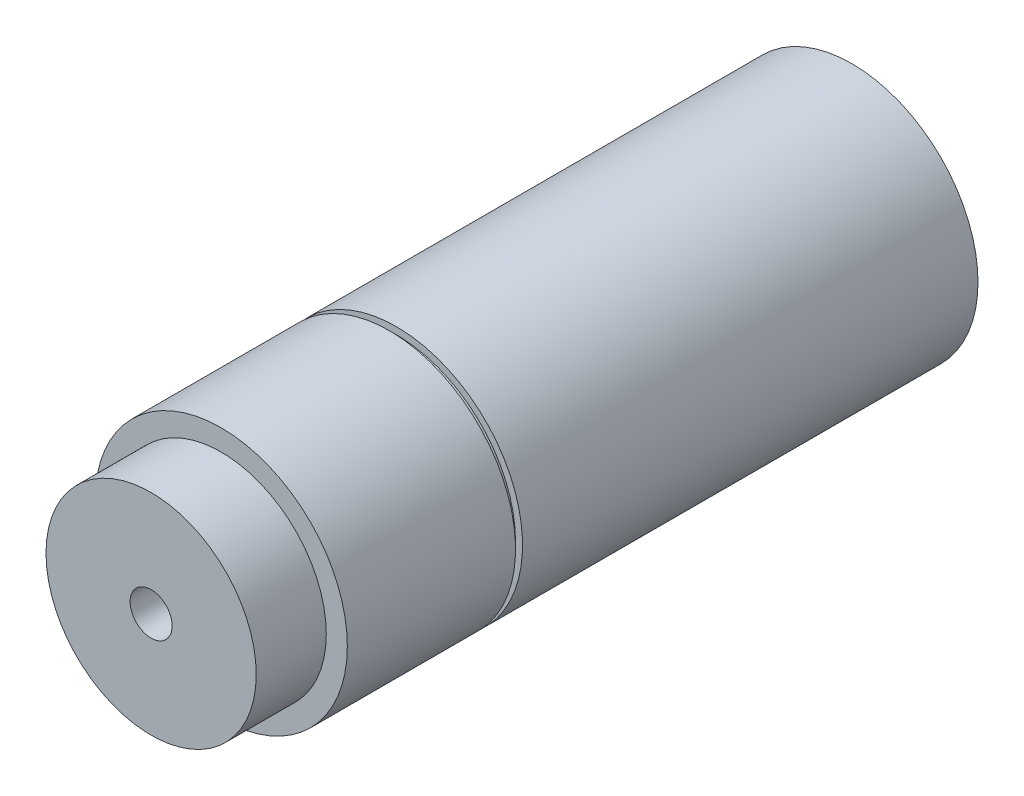
ISO-10303-21;
HEADER;
FILE_DESCRIPTION(('STEP AP214'),'2;1');
FILE_NAME('part.step','',(''),(''),'','','');
FILE_SCHEMA(('AUTOMOTIVE_DESIGN { 1 0 10303 214 1 1 1 1 }'));
ENDSEC;
DATA;
#1=APPLICATION_CONTEXT('core data for automotive mechanical design processes');
#2=APPLICATION_PROTOCOL_DEFINITION('international standard','automotive_design',2000,#1);
#3=PRODUCT_CONTEXT('',#1,'mechanical');
#4=PRODUCT('Part','Part','',(#3));
#5=PRODUCT_RELATED_PRODUCT_CATEGORY('part','',(#4));
#6=PRODUCT_DEFINITION_FORMATION('','',#4);
#7=PRODUCT_DEFINITION_CONTEXT('part definition',#1,'design');
#8=PRODUCT_DEFINITION('design','',#6,#7);
#9=PRODUCT_DEFINITION_SHAPE('','',#8);
#10=(LENGTH_UNIT() NAMED_UNIT(*) SI_UNIT(.MILLI.,.METRE.));
#11=(NAMED_UNIT(*) PLANE_ANGLE_UNIT() SI_UNIT($,.RADIAN.));
#12=(NAMED_UNIT(*) SI_UNIT($,.STERADIAN.) SOLID_ANGLE_UNIT());
#13=UNCERTAINTY_MEASURE_WITH_UNIT(LENGTH_MEASURE(1.E-05),#10,'distance_accuracy_value','');
#14=(GEOMETRIC_REPRESENTATION_CONTEXT(3) GLOBAL_UNCERTAINTY_ASSIGNED_CONTEXT((#13)) GLOBAL_UNIT_ASSIGNED_CONTEXT((#10,
#11,#12)) REPRESENTATION_CONTEXT('',''));
#15=CARTESIAN_POINT('',(0.,0.,0.));
#16=DIRECTION('',(0.,0.,1.));
#17=DIRECTION('',(1.,0.,0.));
#18=AXIS2_PLACEMENT_3D('',#15,#16,#17);
#19=CARTESIAN_POINT('',(0.,0.,100.));
#20=DIRECTION('',(0.,0.,-1.));
#21=DIRECTION('',(-1.,0.,0.));
#22=AXIS2_PLACEMENT_3D('',#19,#20,#21);
#23=CYLINDRICAL_SURFACE('',#22,18.);
#24=CARTESIAN_POINT('',(0.,0.,90.));
#25=DIRECTION('',(0.,0.,1.));
#26=DIRECTION('',(1.,0.,0.));
#27=AXIS2_PLACEMENT_3D('',#24,#25,#26);
#28=CIRCLE('',#27,18.);
#29=CARTESIAN_POINT('',(18.,0.,90.));
#30=VERTEX_POINT('',#29);
#31=EDGE_CURVE('E42',#30,#30,#28,.T.);
#32=ORIENTED_EDGE('',*,*,#31,.F.);
#33=EDGE_LOOP('',(#32));
#34=FACE_BOUND('',#33,.T.);
#35=CARTESIAN_POINT('',(0.,0.,66.));
#36=DIRECTION('',(0.,0.,-1.));
#37=DIRECTION('',(-1.,0.,0.));
#38=AXIS2_PLACEMENT_3D('',#35,#36,#37);
#39=CIRCLE('',#38,18.);
#40=CARTESIAN_POINT('',(-18.,0.,66.));
#41=VERTEX_POINT('',#40);
#42=EDGE_CURVE('E65',#41,#41,#39,.T.);
#43=ORIENTED_EDGE('',*,*,#42,.F.);
#44=EDGE_LOOP('',(#43));
#45=FACE_BOUND('',#44,.T.);
#46=ADVANCED_FACE('F38',(#34,#45),#23,.T.);
#47=CARTESIAN_POINT('',(0.,0.,65.));
#48=DIRECTION('',(0.,0.,-1.));
#49=DIRECTION('',(-1.,0.,0.));
#50=AXIS2_PLACEMENT_3D('',#47,#48,#49);
#51=CIRCLE('',#50,18.);
#52=CARTESIAN_POINT('',(-18.,0.,65.));
#53=VERTEX_POINT('',#52);
#54=EDGE_CURVE('E69',#53,#53,#51,.T.);
#55=ORIENTED_EDGE('',*,*,#54,.T.);
#56=EDGE_LOOP('',(#55));
#57=FACE_BOUND('',#56,.T.);
#58=CARTESIAN_POINT('',(0.,0.,0.));
#59=DIRECTION('',(0.,0.,1.));
#60=DIRECTION('',(1.,0.,0.));
#61=AXIS2_PLACEMENT_3D('',#58,#59,#60);
#62=CIRCLE('',#61,18.);
#63=CARTESIAN_POINT('',(18.,0.,0.));
#64=VERTEX_POINT('',#63);
#65=EDGE_CURVE('E10',#64,#64,#62,.T.);
#66=ORIENTED_EDGE('',*,*,#65,.T.);
#67=EDGE_LOOP('',(#66));
#68=FACE_BOUND('',#67,.T.);
#69=ADVANCED_FACE('F40',(#57,#68),#23,.T.);
#70=CARTESIAN_POINT('',(0.,0.,0.));
#71=DIRECTION('',(0.,0.,1.));
#72=DIRECTION('',(1.,0.,0.));
#73=AXIS2_PLACEMENT_3D('',#70,#71,#72);
#74=PLANE('',#73);
#75=CARTESIAN_POINT('',(0.,0.,0.));
#76=DIRECTION('',(0.,0.,1.));
#77=DIRECTION('',(1.,0.,0.));
#78=AXIS2_PLACEMENT_3D('',#75,#76,#77);
#79=CIRCLE('',#78,3.);
#80=CARTESIAN_POINT('',(3.,0.,0.));
#81=VERTEX_POINT('',#80);
#82=EDGE_CURVE('E57',#81,#81,#79,.T.);
#83=ORIENTED_EDGE('',*,*,#82,.T.);
#84=EDGE_LOOP('',(#83));
#85=FACE_BOUND('',#84,.T.);
#86=ORIENTED_EDGE('',*,*,#65,.F.);
#87=EDGE_LOOP('',(#86));
#88=FACE_BOUND('',#87,.T.);
#89=ADVANCED_FACE('F101',(#85,#88),#74,.F.);
#90=CARTESIAN_POINT('',(0.,0.,90.));
#91=DIRECTION('',(0.,0.,1.));
#92=DIRECTION('',(1.,0.,0.));
#93=AXIS2_PLACEMENT_3D('',#90,#91,#92);
#94=PLANE('',#93);
#95=CARTESIAN_POINT('',(0.,0.,90.));
#96=DIRECTION('',(0.,0.,1.));
#97=DIRECTION('',(1.,0.,0.));
#98=AXIS2_PLACEMENT_3D('',#95,#96,#97);
#99=CIRCLE('',#98,15.);
#100=CARTESIAN_POINT('',(15.,0.,90.));
#101=VERTEX_POINT('',#100);
#102=EDGE_CURVE('E51',#101,#101,#99,.T.);
#103=ORIENTED_EDGE('',*,*,#102,.F.);
#104=EDGE_LOOP('',(#103));
#105=FACE_BOUND('',#104,.T.);
#106=ORIENTED_EDGE('',*,*,#31,.T.);
#107=EDGE_LOOP('',(#106));
#108=FACE_BOUND('',#107,.T.);
#109=ADVANCED_FACE('F105',(#105,#108),#94,.T.);
#110=CARTESIAN_POINT('',(0.,0.,90.));
#111=DIRECTION('',(0.,0.,1.));
#112=DIRECTION('',(1.,0.,0.));
#113=AXIS2_PLACEMENT_3D('',#110,#111,#112);
#114=CYLINDRICAL_SURFACE('',#113,15.);
#115=ORIENTED_EDGE('',*,*,#102,.T.);
#116=EDGE_LOOP('',(#115));
#117=FACE_BOUND('',#116,.T.);
#118=CARTESIAN_POINT('',(0.,0.,100.));
#119=DIRECTION('',(0.,0.,1.));
#120=DIRECTION('',(1.,0.,0.));
#121=AXIS2_PLACEMENT_3D('',#118,#119,#120);
#122=CIRCLE('',#121,15.);
#123=CARTESIAN_POINT('',(15.,0.,100.));
#124=VERTEX_POINT('',#123);
#125=EDGE_CURVE('E53',#124,#124,#122,.T.);
#126=ORIENTED_EDGE('',*,*,#125,.F.);
#127=EDGE_LOOP('',(#126));
#128=FACE_BOUND('',#127,.T.);
#129=ADVANCED_FACE('F107',(#117,#128),#114,.T.);
#130=CARTESIAN_POINT('',(0.,0.,100.));
#131=DIRECTION('',(0.,0.,1.));
#132=DIRECTION('',(1.,0.,0.));
#133=AXIS2_PLACEMENT_3D('',#130,#131,#132);
#134=PLANE('',#133);
#135=CARTESIAN_POINT('',(0.,0.,100.));
#136=DIRECTION('',(0.,0.,1.));
#137=DIRECTION('',(1.,0.,0.));
#138=AXIS2_PLACEMENT_3D('',#135,#136,#137);
#139=CIRCLE('',#138,3.);
#140=CARTESIAN_POINT('',(3.,0.,100.));
#141=VERTEX_POINT('',#140);
#142=EDGE_CURVE('E61',#141,#141,#139,.T.);
#143=ORIENTED_EDGE('',*,*,#142,.F.);
#144=EDGE_LOOP('',(#143));
#145=FACE_BOUND('',#144,.T.);
#146=ORIENTED_EDGE('',*,*,#125,.T.);
#147=EDGE_LOOP('',(#146));
#148=FACE_BOUND('',#147,.T.);
#149=ADVANCED_FACE('F114',(#145,#148),#134,.T.);
#150=CARTESIAN_POINT('',(0.,0.,0.));
#151=DIRECTION('',(0.,0.,1.));
#152=DIRECTION('',(1.,0.,0.));
#153=AXIS2_PLACEMENT_3D('',#150,#151,#152);
#154=CYLINDRICAL_SURFACE('',#153,3.);
#155=ORIENTED_EDGE('',*,*,#82,.F.);
#156=EDGE_LOOP('',(#155));
#157=FACE_BOUND('',#156,.T.);
#158=ORIENTED_EDGE('',*,*,#142,.T.);
#159=EDGE_LOOP('',(#158));
#160=FACE_BOUND('',#159,.T.);
#161=ADVANCED_FACE('F92',(#157,#160),#154,.F.);
#162=CARTESIAN_POINT('',(0.,0.,66.));
#163=DIRECTION('',(0.,0.,-1.));
#164=DIRECTION('',(-1.,0.,0.));
#165=AXIS2_PLACEMENT_3D('',#162,#163,#164);
#166=PLANE('',#165);
#167=CARTESIAN_POINT('',(0.,0.,66.));
#168=DIRECTION('',(0.,0.,-1.));
#169=DIRECTION('',(-1.,0.,0.));
#170=AXIS2_PLACEMENT_3D('',#167,#168,#169);
#171=CIRCLE('',#170,17.);
#172=CARTESIAN_POINT('',(-17.,0.,66.));
#173=VERTEX_POINT('',#172);
#174=EDGE_CURVE('E73',#173,#173,#171,.T.);
#175=ORIENTED_EDGE('',*,*,#174,.F.);
#176=EDGE_LOOP('',(#175));
#177=FACE_BOUND('',#176,.T.);
#178=ORIENTED_EDGE('',*,*,#42,.T.);
#179=EDGE_LOOP('',(#178));
#180=FACE_BOUND('',#179,.T.);
#181=ADVANCED_FACE('F88',(#177,#180),#166,.T.);
#182=CARTESIAN_POINT('',(0.,0.,65.));
#183=DIRECTION('',(0.,0.,-1.));
#184=DIRECTION('',(-1.,0.,0.));
#185=AXIS2_PLACEMENT_3D('',#182,#183,#184);
#186=PLANE('',#185);
#187=CARTESIAN_POINT('',(0.,0.,65.));
#188=DIRECTION('',(0.,0.,-1.));
#189=DIRECTION('',(-1.,0.,0.));
#190=AXIS2_PLACEMENT_3D('',#187,#188,#189);
#191=CIRCLE('',#190,17.);
#192=CARTESIAN_POINT('',(-17.,0.,65.));
#193=VERTEX_POINT('',#192);
#194=EDGE_CURVE('E77',#193,#193,#191,.T.);
#195=ORIENTED_EDGE('',*,*,#194,.T.);
#196=EDGE_LOOP('',(#195));
#197=FACE_BOUND('',#196,.T.);
#198=ORIENTED_EDGE('',*,*,#54,.F.);
#199=EDGE_LOOP('',(#198));
#200=FACE_BOUND('',#199,.T.);
#201=ADVANCED_FACE('F91',(#197,#200),#186,.F.);
#202=CARTESIAN_POINT('',(0.,0.,66.));
#203=DIRECTION('',(0.,0.,-1.));
#204=DIRECTION('',(-1.,0.,0.));
#205=AXIS2_PLACEMENT_3D('',#202,#203,#204);
#206=CYLINDRICAL_SURFACE('',#205,17.);
#207=ORIENTED_EDGE('',*,*,#174,.T.);
#208=EDGE_LOOP('',(#207));
#209=FACE_BOUND('',#208,.T.);
#210=ORIENTED_EDGE('',*,*,#194,.F.);
#211=EDGE_LOOP('',(#210));
#212=FACE_BOUND('',#211,.T.);
#213=ADVANCED_FACE('F85',(#209,#212),#206,.T.);
#214=CLOSED_SHELL('',(#46,#69,#89,#109,#129,#149,#161,#181,#201,#213));
#215=MANIFOLD_SOLID_BREP('B2',#214);
#216=ADVANCED_BREP_SHAPE_REPRESENTATION('',(#18,#215),#14);
#217=SHAPE_DEFINITION_REPRESENTATION(#9,#216);
ENDSEC;
END-ISO-10303-21;
